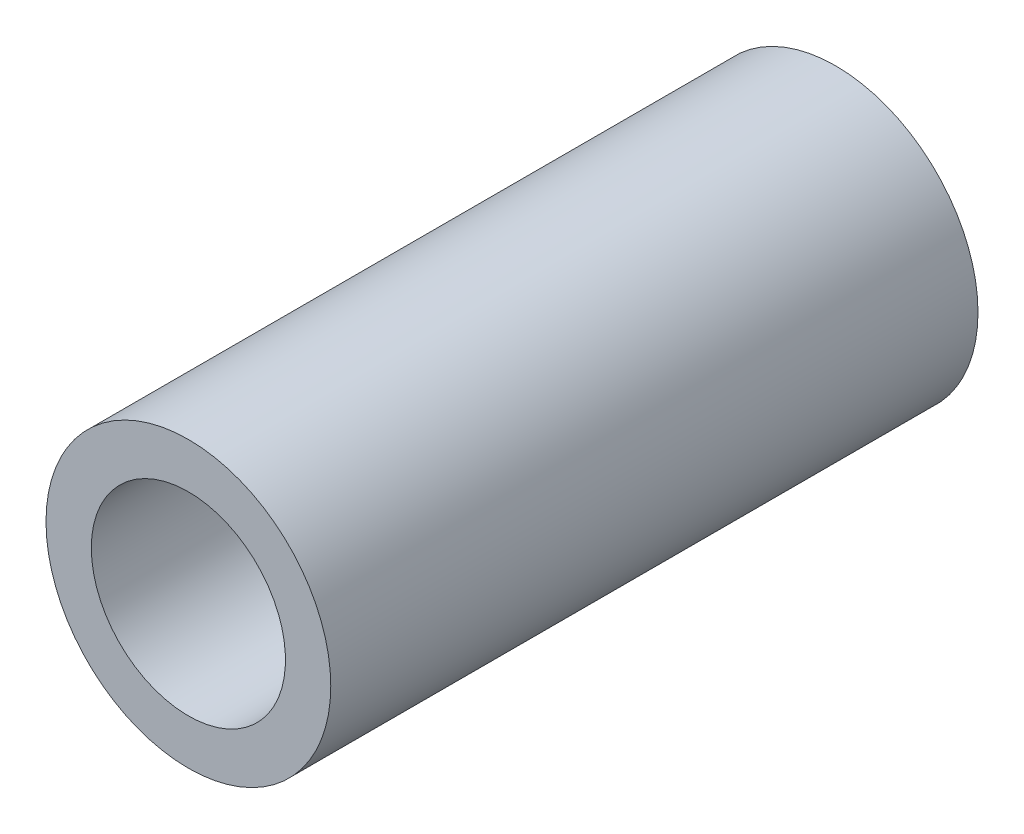
ISO-10303-21;
HEADER;
FILE_DESCRIPTION(('STEP AP214'),'2;1');
FILE_NAME('part.step','',(''),(''),'','','');
FILE_SCHEMA(('AUTOMOTIVE_DESIGN { 1 0 10303 214 1 1 1 1 }'));
ENDSEC;
DATA;
#1=APPLICATION_CONTEXT('core data for automotive mechanical design processes');
#2=APPLICATION_PROTOCOL_DEFINITION('international standard','automotive_design',2000,#1);
#3=PRODUCT_CONTEXT('',#1,'mechanical');
#4=PRODUCT('Part','Part','',(#3));
#5=PRODUCT_RELATED_PRODUCT_CATEGORY('part','',(#4));
#6=PRODUCT_DEFINITION_FORMATION('','',#4);
#7=PRODUCT_DEFINITION_CONTEXT('part definition',#1,'design');
#8=PRODUCT_DEFINITION('design','',#6,#7);
#9=PRODUCT_DEFINITION_SHAPE('','',#8);
#10=(LENGTH_UNIT() NAMED_UNIT(*) SI_UNIT(.MILLI.,.METRE.));
#11=(NAMED_UNIT(*) PLANE_ANGLE_UNIT() SI_UNIT($,.RADIAN.));
#12=(NAMED_UNIT(*) SI_UNIT($,.STERADIAN.) SOLID_ANGLE_UNIT());
#13=UNCERTAINTY_MEASURE_WITH_UNIT(LENGTH_MEASURE(1.E-05),#10,'distance_accuracy_value','');
#14=(GEOMETRIC_REPRESENTATION_CONTEXT(3) GLOBAL_UNCERTAINTY_ASSIGNED_CONTEXT((#13)) GLOBAL_UNIT_ASSIGNED_CONTEXT((#10,
#11,#12)) REPRESENTATION_CONTEXT('',''));
#15=CARTESIAN_POINT('',(0.,0.,0.));
#16=DIRECTION('',(0.,0.,1.));
#17=DIRECTION('',(1.,0.,0.));
#18=AXIS2_PLACEMENT_3D('',#15,#16,#17);
#19=CARTESIAN_POINT('',(0.,0.,100.));
#20=DIRECTION('',(0.,0.,-1.));
#21=DIRECTION('',(-1.,0.,0.));
#22=AXIS2_PLACEMENT_3D('',#19,#20,#21);
#23=CYLINDRICAL_SURFACE('',#22,22.);
#24=CARTESIAN_POINT('',(0.,0.,100.));
#25=DIRECTION('',(0.,0.,1.));
#26=DIRECTION('',(1.,0.,0.));
#27=AXIS2_PLACEMENT_3D('',#24,#25,#26);
#28=CIRCLE('',#27,22.);
#29=CARTESIAN_POINT('',(22.,0.,100.));
#30=VERTEX_POINT('',#29);
#31=EDGE_CURVE('E10',#30,#30,#28,.T.);
#32=ORIENTED_EDGE('',*,*,#31,.F.);
#33=EDGE_LOOP('',(#32));
#34=FACE_BOUND('',#33,.T.);
#35=CARTESIAN_POINT('',(0.,0.,0.));
#36=DIRECTION('',(0.,0.,1.));
#37=DIRECTION('',(1.,0.,0.));
#38=AXIS2_PLACEMENT_3D('',#35,#36,#37);
#39=CIRCLE('',#38,22.);
#40=CARTESIAN_POINT('',(22.,0.,0.));
#41=VERTEX_POINT('',#40);
#42=EDGE_CURVE('E35',#41,#41,#39,.T.);
#43=ORIENTED_EDGE('',*,*,#42,.T.);
#44=EDGE_LOOP('',(#43));
#45=FACE_BOUND('',#44,.T.);
#46=ADVANCED_FACE('F32',(#34,#45),#23,.T.);
#47=CARTESIAN_POINT('',(0.,0.,100.));
#48=DIRECTION('',(0.,0.,1.));
#49=DIRECTION('',(1.,0.,0.));
#50=AXIS2_PLACEMENT_3D('',#47,#48,#49);
#51=PLANE('',#50);
#52=CARTESIAN_POINT('',(0.,0.,100.));
#53=DIRECTION('',(0.,0.,-1.));
#54=DIRECTION('',(-1.,0.,0.));
#55=AXIS2_PLACEMENT_3D('',#52,#53,#54);
#56=CIRCLE('',#55,15.);
#57=CARTESIAN_POINT('',(-15.,0.,100.));
#58=VERTEX_POINT('',#57);
#59=EDGE_CURVE('E42',#58,#58,#56,.T.);
#60=ORIENTED_EDGE('',*,*,#59,.T.);
#61=EDGE_LOOP('',(#60));
#62=FACE_BOUND('',#61,.T.);
#63=ORIENTED_EDGE('',*,*,#31,.T.);
#64=EDGE_LOOP('',(#63));
#65=FACE_BOUND('',#64,.T.);
#66=ADVANCED_FACE('F50',(#62,#65),#51,.T.);
#67=CARTESIAN_POINT('',(0.,0.,0.));
#68=DIRECTION('',(0.,0.,1.));
#69=DIRECTION('',(1.,0.,0.));
#70=AXIS2_PLACEMENT_3D('',#67,#68,#69);
#71=PLANE('',#70);
#72=CARTESIAN_POINT('',(0.,0.,0.));
#73=DIRECTION('',(0.,0.,-1.));
#74=DIRECTION('',(-1.,0.,0.));
#75=AXIS2_PLACEMENT_3D('',#72,#73,#74);
#76=CIRCLE('',#75,15.);
#77=CARTESIAN_POINT('',(-15.,0.,0.));
#78=VERTEX_POINT('',#77);
#79=EDGE_CURVE('E44',#78,#78,#76,.T.);
#80=ORIENTED_EDGE('',*,*,#79,.F.);
#81=EDGE_LOOP('',(#80));
#82=FACE_BOUND('',#81,.T.);
#83=ORIENTED_EDGE('',*,*,#42,.F.);
#84=EDGE_LOOP('',(#83));
#85=FACE_BOUND('',#84,.T.);
#86=ADVANCED_FACE('F55',(#82,#85),#71,.F.);
#87=CARTESIAN_POINT('',(0.,0.,100.));
#88=DIRECTION('',(0.,0.,-1.));
#89=DIRECTION('',(-1.,0.,0.));
#90=AXIS2_PLACEMENT_3D('',#87,#88,#89);
#91=CYLINDRICAL_SURFACE('',#90,15.);
#92=ORIENTED_EDGE('',*,*,#59,.F.);
#93=EDGE_LOOP('',(#92));
#94=FACE_BOUND('',#93,.T.);
#95=ORIENTED_EDGE('',*,*,#79,.T.);
#96=EDGE_LOOP('',(#95));
#97=FACE_BOUND('',#96,.T.);
#98=ADVANCED_FACE('F52',(#94,#97),#91,.F.);
#99=CLOSED_SHELL('',(#46,#66,#86,#98));
#100=MANIFOLD_SOLID_BREP('B2',#99);
#101=ADVANCED_BREP_SHAPE_REPRESENTATION('',(#18,#100),#14);
#102=SHAPE_DEFINITION_REPRESENTATION(#9,#101);
ENDSEC;
END-ISO-10303-21;
